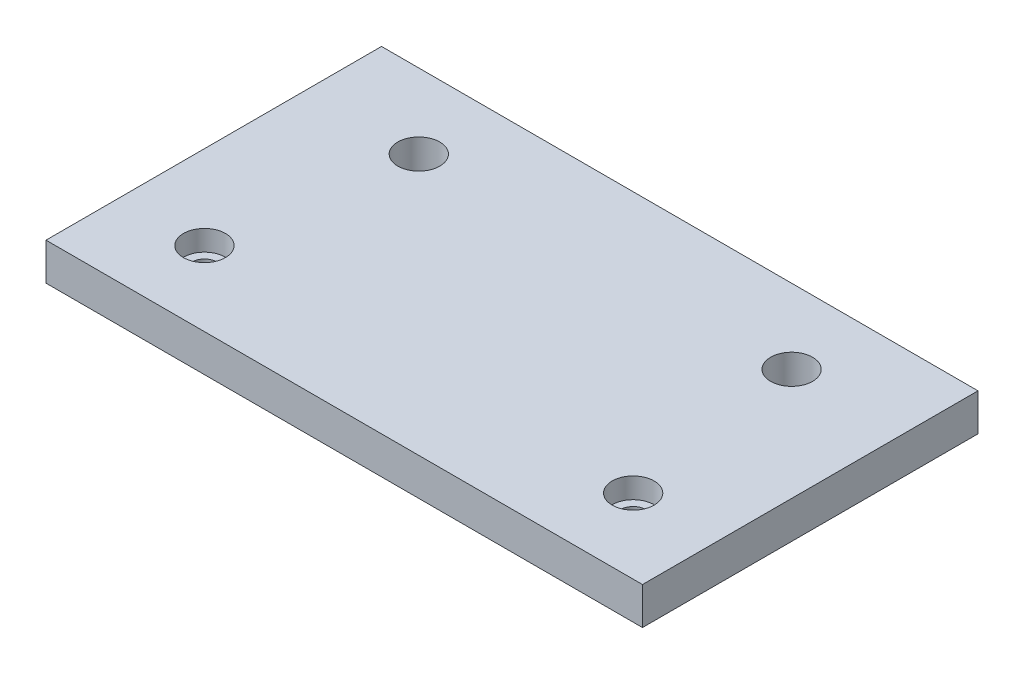
ISO-10303-21;
HEADER;
FILE_DESCRIPTION(('STEP AP214'),'2;1');
FILE_NAME('part.step','',(''),(''),'','','');
FILE_SCHEMA(('AUTOMOTIVE_DESIGN { 1 0 10303 214 1 1 1 1 }'));
ENDSEC;
DATA;
#1=APPLICATION_CONTEXT('core data for automotive mechanical design processes');
#2=APPLICATION_PROTOCOL_DEFINITION('international standard','automotive_design',2000,#1);
#3=PRODUCT_CONTEXT('',#1,'mechanical');
#4=PRODUCT('Part','Part','',(#3));
#5=PRODUCT_RELATED_PRODUCT_CATEGORY('part','',(#4));
#6=PRODUCT_DEFINITION_FORMATION('','',#4);
#7=PRODUCT_DEFINITION_CONTEXT('part definition',#1,'design');
#8=PRODUCT_DEFINITION('design','',#6,#7);
#9=PRODUCT_DEFINITION_SHAPE('','',#8);
#10=(LENGTH_UNIT() NAMED_UNIT(*) SI_UNIT(.MILLI.,.METRE.));
#11=(NAMED_UNIT(*) PLANE_ANGLE_UNIT() SI_UNIT($,.RADIAN.));
#12=(NAMED_UNIT(*) SI_UNIT($,.STERADIAN.) SOLID_ANGLE_UNIT());
#13=UNCERTAINTY_MEASURE_WITH_UNIT(LENGTH_MEASURE(1.E-05),#10,'distance_accuracy_value','');
#14=(GEOMETRIC_REPRESENTATION_CONTEXT(3) GLOBAL_UNCERTAINTY_ASSIGNED_CONTEXT((#13)) GLOBAL_UNIT_ASSIGNED_CONTEXT((#10,
#11,#12)) REPRESENTATION_CONTEXT('',''));
#15=CARTESIAN_POINT('',(0.,0.,0.));
#16=DIRECTION('',(0.,0.,1.));
#17=DIRECTION('',(1.,0.,0.));
#18=AXIS2_PLACEMENT_3D('',#15,#16,#17);
#19=CARTESIAN_POINT('',(0.,6.35,0.));
#20=DIRECTION('',(1.,0.,0.));
#21=DIRECTION('',(0.,0.,-1.));
#22=AXIS2_PLACEMENT_3D('',#19,#20,#21);
#23=PLANE('',#22);
#24=DIRECTION('',(0.,0.,1.));
#25=VECTOR('',#24,1.);
#26=CARTESIAN_POINT('',(0.,0.,0.));
#27=LINE('',#26,#25);
#28=CARTESIAN_POINT('',(0.,0.,0.));
#29=VERTEX_POINT('',#28);
#30=CARTESIAN_POINT('',(0.,0.,57.15));
#31=VERTEX_POINT('',#30);
#32=EDGE_CURVE('E113',#29,#31,#27,.T.);
#33=ORIENTED_EDGE('',*,*,#32,.T.);
#34=DIRECTION('',(0.,-1.,0.));
#35=VECTOR('',#34,1.);
#36=CARTESIAN_POINT('',(0.,6.35,57.15));
#37=LINE('',#36,#35);
#38=CARTESIAN_POINT('',(0.,6.35,57.15));
#39=VERTEX_POINT('',#38);
#40=EDGE_CURVE('E11',#39,#31,#37,.T.);
#41=ORIENTED_EDGE('',*,*,#40,.F.);
#42=DIRECTION('',(0.,0.,1.));
#43=VECTOR('',#42,1.);
#44=CARTESIAN_POINT('',(0.,6.35,0.));
#45=LINE('',#44,#43);
#46=CARTESIAN_POINT('',(0.,6.35,0.));
#47=VERTEX_POINT('',#46);
#48=EDGE_CURVE('E97',#47,#39,#45,.T.);
#49=ORIENTED_EDGE('',*,*,#48,.F.);
#50=DIRECTION('',(0.,-1.,0.));
#51=VECTOR('',#50,1.);
#52=CARTESIAN_POINT('',(0.,6.35,0.));
#53=LINE('',#52,#51);
#54=EDGE_CURVE('E109',#47,#29,#53,.T.);
#55=ORIENTED_EDGE('',*,*,#54,.T.);
#56=EDGE_LOOP('',(#33,#41,#49,#55));
#57=FACE_BOUND('',#56,.T.);
#58=ADVANCED_FACE('F45',(#57),#23,.F.);
#59=CARTESIAN_POINT('',(0.,6.35,57.15));
#60=DIRECTION('',(0.,0.,-1.));
#61=DIRECTION('',(-1.,0.,0.));
#62=AXIS2_PLACEMENT_3D('',#59,#60,#61);
#63=PLANE('',#62);
#64=DIRECTION('',(1.,0.,0.));
#65=VECTOR('',#64,1.);
#66=CARTESIAN_POINT('',(0.,0.,57.15));
#67=LINE('',#66,#65);
#68=CARTESIAN_POINT('',(101.6,0.,57.15));
#69=VERTEX_POINT('',#68);
#70=EDGE_CURVE('E102',#31,#69,#67,.T.);
#71=ORIENTED_EDGE('',*,*,#70,.T.);
#72=DIRECTION('',(0.,-1.,0.));
#73=VECTOR('',#72,1.);
#74=CARTESIAN_POINT('',(101.6,6.35,57.15));
#75=LINE('',#74,#73);
#76=CARTESIAN_POINT('',(101.6,6.35,57.15));
#77=VERTEX_POINT('',#76);
#78=EDGE_CURVE('E54',#77,#69,#75,.T.);
#79=ORIENTED_EDGE('',*,*,#78,.F.);
#80=DIRECTION('',(1.,0.,0.));
#81=VECTOR('',#80,1.);
#82=CARTESIAN_POINT('',(0.,6.35,57.15));
#83=LINE('',#82,#81);
#84=EDGE_CURVE('E92',#39,#77,#83,.T.);
#85=ORIENTED_EDGE('',*,*,#84,.F.);
#86=ORIENTED_EDGE('',*,*,#40,.T.);
#87=EDGE_LOOP('',(#71,#79,#85,#86));
#88=FACE_BOUND('',#87,.T.);
#89=ADVANCED_FACE('F101',(#88),#63,.F.);
#90=CARTESIAN_POINT('',(101.6,6.35,0.));
#91=DIRECTION('',(-1.,0.,0.));
#92=DIRECTION('',(0.,0.,1.));
#93=AXIS2_PLACEMENT_3D('',#90,#91,#92);
#94=PLANE('',#93);
#95=DIRECTION('',(0.,0.,-1.));
#96=VECTOR('',#95,1.);
#97=CARTESIAN_POINT('',(101.6,0.,0.));
#98=LINE('',#97,#96);
#99=CARTESIAN_POINT('',(101.6,0.,0.));
#100=VERTEX_POINT('',#99);
#101=EDGE_CURVE('E79',#69,#100,#98,.T.);
#102=ORIENTED_EDGE('',*,*,#101,.T.);
#103=DIRECTION('',(0.,-1.,0.));
#104=VECTOR('',#103,1.);
#105=CARTESIAN_POINT('',(101.6,6.35,0.));
#106=LINE('',#105,#104);
#107=CARTESIAN_POINT('',(101.6,6.35,0.));
#108=VERTEX_POINT('',#107);
#109=EDGE_CURVE('E104',#108,#100,#106,.T.);
#110=ORIENTED_EDGE('',*,*,#109,.F.);
#111=DIRECTION('',(0.,0.,-1.));
#112=VECTOR('',#111,1.);
#113=CARTESIAN_POINT('',(101.6,6.35,0.));
#114=LINE('',#113,#112);
#115=EDGE_CURVE('E95',#77,#108,#114,.T.);
#116=ORIENTED_EDGE('',*,*,#115,.F.);
#117=ORIENTED_EDGE('',*,*,#78,.T.);
#118=EDGE_LOOP('',(#102,#110,#116,#117));
#119=FACE_BOUND('',#118,.T.);
#120=ADVANCED_FACE('F105',(#119),#94,.F.);
#121=CARTESIAN_POINT('',(0.,6.35,0.));
#122=DIRECTION('',(0.,0.,1.));
#123=DIRECTION('',(1.,0.,0.));
#124=AXIS2_PLACEMENT_3D('',#121,#122,#123);
#125=PLANE('',#124);
#126=DIRECTION('',(-1.,0.,0.));
#127=VECTOR('',#126,1.);
#128=CARTESIAN_POINT('',(0.,0.,0.));
#129=LINE('',#128,#127);
#130=EDGE_CURVE('E85',#100,#29,#129,.T.);
#131=ORIENTED_EDGE('',*,*,#130,.T.);
#132=ORIENTED_EDGE('',*,*,#54,.F.);
#133=DIRECTION('',(-1.,0.,0.));
#134=VECTOR('',#133,1.);
#135=CARTESIAN_POINT('',(0.,6.35,0.));
#136=LINE('',#135,#134);
#137=EDGE_CURVE('E62',#108,#47,#136,.T.);
#138=ORIENTED_EDGE('',*,*,#137,.F.);
#139=ORIENTED_EDGE('',*,*,#109,.T.);
#140=EDGE_LOOP('',(#131,#132,#138,#139));
#141=FACE_BOUND('',#140,.T.);
#142=ADVANCED_FACE('F127',(#141),#125,.F.);
#143=CARTESIAN_POINT('',(0.,6.35,0.));
#144=DIRECTION('',(0.,1.,0.));
#145=DIRECTION('',(0.,0.,1.));
#146=AXIS2_PLACEMENT_3D('',#143,#144,#145);
#147=PLANE('',#146);
#148=CARTESIAN_POINT('',(19.05,6.35,12.7));
#149=DIRECTION('',(0.,1.,0.));
#150=DIRECTION('',(0.,0.,1.));
#151=AXIS2_PLACEMENT_3D('',#148,#149,#150);
#152=CIRCLE('',#151,3.57123999999996);
#153=CARTESIAN_POINT('',(19.05,6.35,16.27124));
#154=VERTEX_POINT('',#153);
#155=EDGE_CURVE('E177',#154,#154,#152,.T.);
#156=ORIENTED_EDGE('',*,*,#155,.F.);
#157=EDGE_LOOP('',(#156));
#158=FACE_BOUND('',#157,.T.);
#159=CARTESIAN_POINT('',(82.55,6.35,12.7));
#160=DIRECTION('',(0.,1.,0.));
#161=DIRECTION('',(0.,0.,1.));
#162=AXIS2_PLACEMENT_3D('',#159,#160,#161);
#163=CIRCLE('',#162,3.57123999999996);
#164=CARTESIAN_POINT('',(82.55,6.35,16.27124));
#165=VERTEX_POINT('',#164);
#166=EDGE_CURVE('E169',#165,#165,#163,.T.);
#167=ORIENTED_EDGE('',*,*,#166,.F.);
#168=EDGE_LOOP('',(#167));
#169=FACE_BOUND('',#168,.T.);
#170=CARTESIAN_POINT('',(14.2875,6.35,44.45));
#171=DIRECTION('',(0.,1.,0.));
#172=DIRECTION('',(0.,0.,1.));
#173=AXIS2_PLACEMENT_3D('',#170,#171,#172);
#174=CIRCLE('',#173,3.57251);
#175=CARTESIAN_POINT('',(14.2875,6.35,48.02251));
#176=VERTEX_POINT('',#175);
#177=EDGE_CURVE('E161',#176,#176,#174,.T.);
#178=ORIENTED_EDGE('',*,*,#177,.F.);
#179=EDGE_LOOP('',(#178));
#180=FACE_BOUND('',#179,.T.);
#181=CARTESIAN_POINT('',(87.3125,6.35,44.45));
#182=DIRECTION('',(0.,1.,0.));
#183=DIRECTION('',(0.,0.,1.));
#184=AXIS2_PLACEMENT_3D('',#181,#182,#183);
#185=CIRCLE('',#184,3.57251);
#186=CARTESIAN_POINT('',(87.3125,6.35,48.02251));
#187=VERTEX_POINT('',#186);
#188=EDGE_CURVE('E145',#187,#187,#185,.T.);
#189=ORIENTED_EDGE('',*,*,#188,.F.);
#190=EDGE_LOOP('',(#189));
#191=FACE_BOUND('',#190,.T.);
#192=ORIENTED_EDGE('',*,*,#48,.T.);
#193=ORIENTED_EDGE('',*,*,#84,.T.);
#194=ORIENTED_EDGE('',*,*,#115,.T.);
#195=ORIENTED_EDGE('',*,*,#137,.T.);
#196=EDGE_LOOP('',(#192,#193,#194,#195));
#197=FACE_BOUND('',#196,.T.);
#198=ADVANCED_FACE('F93',(#158,#169,#180,#191,#197),#147,.T.);
#199=CARTESIAN_POINT('',(0.,0.,0.));
#200=DIRECTION('',(0.,1.,0.));
#201=DIRECTION('',(0.,0.,1.));
#202=AXIS2_PLACEMENT_3D('',#199,#200,#201);
#203=PLANE('',#202);
#204=CARTESIAN_POINT('',(19.05,0.,12.7));
#205=DIRECTION('',(0.,1.,0.));
#206=DIRECTION('',(0.,0.,1.));
#207=AXIS2_PLACEMENT_3D('',#204,#205,#206);
#208=CIRCLE('',#207,3.57123999999998);
#209=CARTESIAN_POINT('',(19.05,0.,16.27124));
#210=VERTEX_POINT('',#209);
#211=EDGE_CURVE('E173',#210,#210,#208,.T.);
#212=ORIENTED_EDGE('',*,*,#211,.T.);
#213=EDGE_LOOP('',(#212));
#214=FACE_BOUND('',#213,.T.);
#215=CARTESIAN_POINT('',(82.55,0.,12.7));
#216=DIRECTION('',(0.,1.,0.));
#217=DIRECTION('',(0.,0.,1.));
#218=AXIS2_PLACEMENT_3D('',#215,#216,#217);
#219=CIRCLE('',#218,3.57123999999998);
#220=CARTESIAN_POINT('',(82.55,0.,16.27124));
#221=VERTEX_POINT('',#220);
#222=EDGE_CURVE('E165',#221,#221,#219,.T.);
#223=ORIENTED_EDGE('',*,*,#222,.T.);
#224=EDGE_LOOP('',(#223));
#225=FACE_BOUND('',#224,.T.);
#226=CARTESIAN_POINT('',(14.2875,0.,44.45));
#227=DIRECTION('',(0.,1.,0.));
#228=DIRECTION('',(0.,0.,1.));
#229=AXIS2_PLACEMENT_3D('',#226,#227,#228);
#230=CIRCLE('',#229,2.15265);
#231=CARTESIAN_POINT('',(14.2875,0.,46.60265));
#232=VERTEX_POINT('',#231);
#233=EDGE_CURVE('E149',#232,#232,#230,.T.);
#234=ORIENTED_EDGE('',*,*,#233,.T.);
#235=EDGE_LOOP('',(#234));
#236=FACE_BOUND('',#235,.T.);
#237=CARTESIAN_POINT('',(87.3125,0.,44.45));
#238=DIRECTION('',(0.,1.,0.));
#239=DIRECTION('',(0.,0.,1.));
#240=AXIS2_PLACEMENT_3D('',#237,#238,#239);
#241=CIRCLE('',#240,2.15265);
#242=CARTESIAN_POINT('',(87.3125,0.,46.60265));
#243=VERTEX_POINT('',#242);
#244=EDGE_CURVE('E117',#243,#243,#241,.T.);
#245=ORIENTED_EDGE('',*,*,#244,.T.);
#246=EDGE_LOOP('',(#245));
#247=FACE_BOUND('',#246,.T.);
#248=ORIENTED_EDGE('',*,*,#32,.F.);
#249=ORIENTED_EDGE('',*,*,#130,.F.);
#250=ORIENTED_EDGE('',*,*,#101,.F.);
#251=ORIENTED_EDGE('',*,*,#70,.F.);
#252=EDGE_LOOP('',(#248,#249,#250,#251));
#253=FACE_BOUND('',#252,.T.);
#254=ADVANCED_FACE('F130',(#214,#225,#236,#247,#253),#203,.F.);
#255=CARTESIAN_POINT('',(87.3125,6.35,44.45));
#256=DIRECTION('',(0.,1.,0.));
#257=DIRECTION('',(0.,0.,1.));
#258=AXIS2_PLACEMENT_3D('',#255,#256,#257);
#259=CYLINDRICAL_SURFACE('',#258,2.15265);
#260=ORIENTED_EDGE('',*,*,#244,.F.);
#261=EDGE_LOOP('',(#260));
#262=FACE_BOUND('',#261,.T.);
#263=CARTESIAN_POINT('',(87.3125,2.8448,44.45));
#264=DIRECTION('',(0.,1.,0.));
#265=DIRECTION('',(0.,0.,1.));
#266=AXIS2_PLACEMENT_3D('',#263,#264,#265);
#267=CIRCLE('',#266,2.15265000000001);
#268=CARTESIAN_POINT('',(87.3125,2.8448,46.60265));
#269=VERTEX_POINT('',#268);
#270=EDGE_CURVE('E137',#269,#269,#267,.T.);
#271=ORIENTED_EDGE('',*,*,#270,.T.);
#272=EDGE_LOOP('',(#271));
#273=FACE_BOUND('',#272,.T.);
#274=ADVANCED_FACE('F206',(#262,#273),#259,.F.);
#275=CARTESIAN_POINT('',(89.46515,2.8448,44.45));
#276=DIRECTION('',(0.,-1.,0.));
#277=DIRECTION('',(0.,0.,-1.));
#278=AXIS2_PLACEMENT_3D('',#275,#276,#277);
#279=PLANE('',#278);
#280=ORIENTED_EDGE('',*,*,#270,.F.);
#281=EDGE_LOOP('',(#280));
#282=FACE_BOUND('',#281,.T.);
#283=CARTESIAN_POINT('',(87.3125,2.8448,44.45));
#284=DIRECTION('',(0.,1.,0.));
#285=DIRECTION('',(0.,0.,1.));
#286=AXIS2_PLACEMENT_3D('',#283,#284,#285);
#287=CIRCLE('',#286,3.57251);
#288=CARTESIAN_POINT('',(87.3125,2.8448,48.02251));
#289=VERTEX_POINT('',#288);
#290=EDGE_CURVE('E141',#289,#289,#287,.T.);
#291=ORIENTED_EDGE('',*,*,#290,.T.);
#292=EDGE_LOOP('',(#291));
#293=FACE_BOUND('',#292,.T.);
#294=ADVANCED_FACE('F196',(#282,#293),#279,.F.);
#295=CARTESIAN_POINT('',(87.3125,6.35,44.45));
#296=DIRECTION('',(0.,1.,0.));
#297=DIRECTION('',(0.,0.,1.));
#298=AXIS2_PLACEMENT_3D('',#295,#296,#297);
#299=CYLINDRICAL_SURFACE('',#298,3.57251);
#300=ORIENTED_EDGE('',*,*,#290,.F.);
#301=EDGE_LOOP('',(#300));
#302=FACE_BOUND('',#301,.T.);
#303=ORIENTED_EDGE('',*,*,#188,.T.);
#304=EDGE_LOOP('',(#303));
#305=FACE_BOUND('',#304,.T.);
#306=ADVANCED_FACE('F193',(#302,#305),#299,.F.);
#307=CARTESIAN_POINT('',(14.2875,6.35,44.45));
#308=DIRECTION('',(0.,1.,0.));
#309=DIRECTION('',(0.,0.,1.));
#310=AXIS2_PLACEMENT_3D('',#307,#308,#309);
#311=CYLINDRICAL_SURFACE('',#310,2.15265);
#312=ORIENTED_EDGE('',*,*,#233,.F.);
#313=EDGE_LOOP('',(#312));
#314=FACE_BOUND('',#313,.T.);
#315=CARTESIAN_POINT('',(14.2875,2.8448,44.45));
#316=DIRECTION('',(0.,1.,0.));
#317=DIRECTION('',(0.,0.,1.));
#318=AXIS2_PLACEMENT_3D('',#315,#316,#317);
#319=CIRCLE('',#318,2.15265);
#320=CARTESIAN_POINT('',(14.2875,2.8448,46.60265));
#321=VERTEX_POINT('',#320);
#322=EDGE_CURVE('E153',#321,#321,#319,.T.);
#323=ORIENTED_EDGE('',*,*,#322,.T.);
#324=EDGE_LOOP('',(#323));
#325=FACE_BOUND('',#324,.T.);
#326=ADVANCED_FACE('F195',(#314,#325),#311,.F.);
#327=CARTESIAN_POINT('',(16.44015,2.8448,44.45));
#328=DIRECTION('',(0.,-1.,0.));
#329=DIRECTION('',(0.,0.,-1.));
#330=AXIS2_PLACEMENT_3D('',#327,#328,#329);
#331=PLANE('',#330);
#332=ORIENTED_EDGE('',*,*,#322,.F.);
#333=EDGE_LOOP('',(#332));
#334=FACE_BOUND('',#333,.T.);
#335=CARTESIAN_POINT('',(14.2875,2.8448,44.45));
#336=DIRECTION('',(0.,1.,0.));
#337=DIRECTION('',(0.,0.,1.));
#338=AXIS2_PLACEMENT_3D('',#335,#336,#337);
#339=CIRCLE('',#338,3.57251);
#340=CARTESIAN_POINT('',(14.2875,2.8448,48.02251));
#341=VERTEX_POINT('',#340);
#342=EDGE_CURVE('E157',#341,#341,#339,.T.);
#343=ORIENTED_EDGE('',*,*,#342,.T.);
#344=EDGE_LOOP('',(#343));
#345=FACE_BOUND('',#344,.T.);
#346=ADVANCED_FACE('F203',(#334,#345),#331,.F.);
#347=CARTESIAN_POINT('',(14.2875,6.35,44.45));
#348=DIRECTION('',(0.,1.,0.));
#349=DIRECTION('',(0.,0.,1.));
#350=AXIS2_PLACEMENT_3D('',#347,#348,#349);
#351=CYLINDRICAL_SURFACE('',#350,3.57251);
#352=ORIENTED_EDGE('',*,*,#342,.F.);
#353=EDGE_LOOP('',(#352));
#354=FACE_BOUND('',#353,.T.);
#355=ORIENTED_EDGE('',*,*,#177,.T.);
#356=EDGE_LOOP('',(#355));
#357=FACE_BOUND('',#356,.T.);
#358=ADVANCED_FACE('F261',(#354,#357),#351,.F.);
#359=CARTESIAN_POINT('',(82.55,6.35,12.7));
#360=DIRECTION('',(0.,1.,0.));
#361=DIRECTION('',(0.,0.,1.));
#362=AXIS2_PLACEMENT_3D('',#359,#360,#361);
#363=CYLINDRICAL_SURFACE('',#362,3.57123999999998);
#364=ORIENTED_EDGE('',*,*,#222,.F.);
#365=EDGE_LOOP('',(#364));
#366=FACE_BOUND('',#365,.T.);
#367=ORIENTED_EDGE('',*,*,#166,.T.);
#368=EDGE_LOOP('',(#367));
#369=FACE_BOUND('',#368,.T.);
#370=ADVANCED_FACE('F271',(#366,#369),#363,.F.);
#371=CARTESIAN_POINT('',(19.05,6.35,12.7));
#372=DIRECTION('',(0.,1.,0.));
#373=DIRECTION('',(0.,0.,1.));
#374=AXIS2_PLACEMENT_3D('',#371,#372,#373);
#375=CYLINDRICAL_SURFACE('',#374,3.57123999999998);
#376=ORIENTED_EDGE('',*,*,#211,.F.);
#377=EDGE_LOOP('',(#376));
#378=FACE_BOUND('',#377,.T.);
#379=ORIENTED_EDGE('',*,*,#155,.T.);
#380=EDGE_LOOP('',(#379));
#381=FACE_BOUND('',#380,.T.);
#382=ADVANCED_FACE('F182',(#378,#381),#375,.F.);
#383=CLOSED_SHELL('',(#58,#89,#120,#142,#198,#254,#274,#294,#306,#326,#346,#358,#370,#382));
#384=MANIFOLD_SOLID_BREP('B2',#383);
#385=ADVANCED_BREP_SHAPE_REPRESENTATION('',(#18,#384),#14);
#386=SHAPE_DEFINITION_REPRESENTATION(#9,#385);
ENDSEC;
END-ISO-10303-21;
